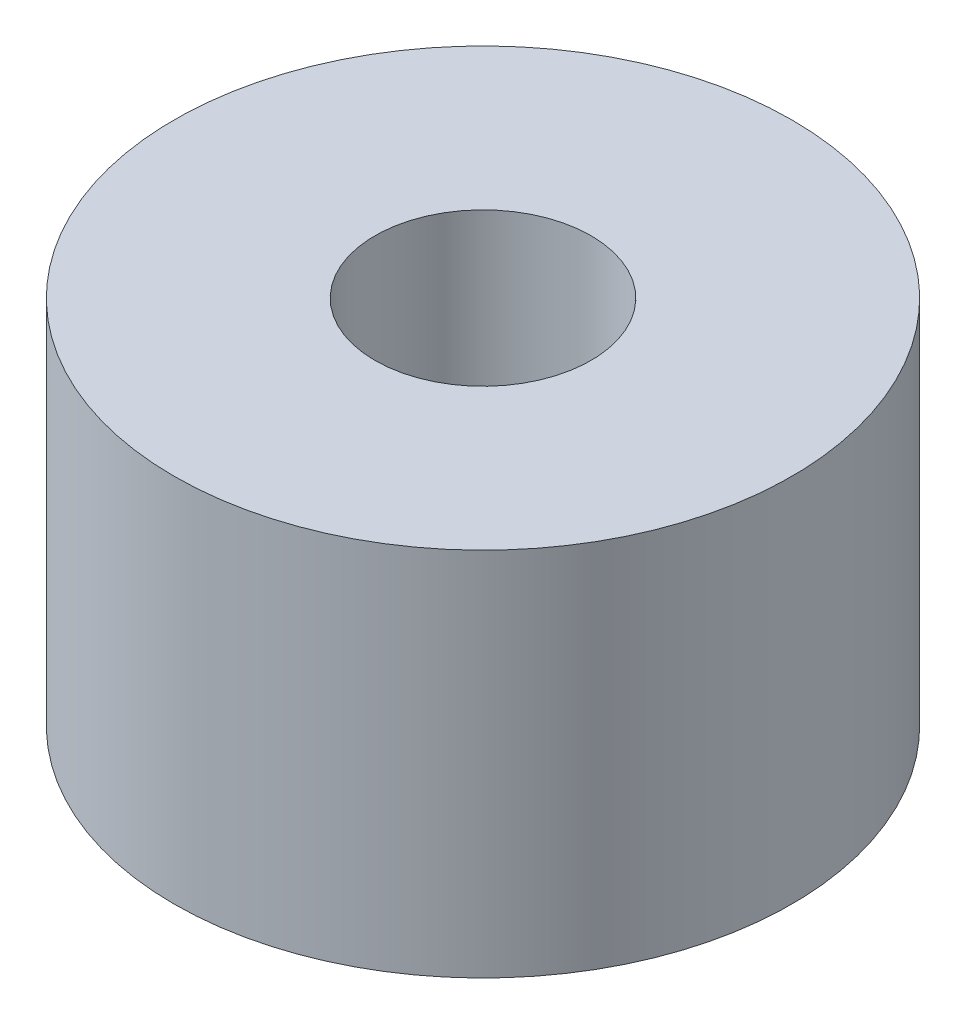
ISO-10303-21;
HEADER;
FILE_DESCRIPTION(('STEP AP214'),'2;1');
FILE_NAME('part.step','',(''),(''),'','','');
FILE_SCHEMA(('AUTOMOTIVE_DESIGN { 1 0 10303 214 1 1 1 1 }'));
ENDSEC;
DATA;
#1=APPLICATION_CONTEXT('core data for automotive mechanical design processes');
#2=APPLICATION_PROTOCOL_DEFINITION('international standard','automotive_design',2000,#1);
#3=PRODUCT_CONTEXT('',#1,'mechanical');
#4=PRODUCT('Part','Part','',(#3));
#5=PRODUCT_RELATED_PRODUCT_CATEGORY('part','',(#4));
#6=PRODUCT_DEFINITION_FORMATION('','',#4);
#7=PRODUCT_DEFINITION_CONTEXT('part definition',#1,'design');
#8=PRODUCT_DEFINITION('design','',#6,#7);
#9=PRODUCT_DEFINITION_SHAPE('','',#8);
#10=(LENGTH_UNIT() NAMED_UNIT(*) SI_UNIT(.MILLI.,.METRE.));
#11=(NAMED_UNIT(*) PLANE_ANGLE_UNIT() SI_UNIT($,.RADIAN.));
#12=(NAMED_UNIT(*) SI_UNIT($,.STERADIAN.) SOLID_ANGLE_UNIT());
#13=UNCERTAINTY_MEASURE_WITH_UNIT(LENGTH_MEASURE(1.E-05),#10,'distance_accuracy_value','');
#14=(GEOMETRIC_REPRESENTATION_CONTEXT(3) GLOBAL_UNCERTAINTY_ASSIGNED_CONTEXT((#13)) GLOBAL_UNIT_ASSIGNED_CONTEXT((#10,
#11,#12)) REPRESENTATION_CONTEXT('',''));
#15=CARTESIAN_POINT('',(0.,0.,0.));
#16=DIRECTION('',(0.,0.,1.));
#17=DIRECTION('',(1.,0.,0.));
#18=AXIS2_PLACEMENT_3D('',#15,#16,#17);
#19=CARTESIAN_POINT('',(0.,12.,0.));
#20=DIRECTION('',(0.,1.,0.));
#21=DIRECTION('',(0.,0.,1.));
#22=AXIS2_PLACEMENT_3D('',#19,#20,#21);
#23=PLANE('',#22);
#24=CARTESIAN_POINT('',(0.,12.,0.));
#25=DIRECTION('',(0.,1.,0.));
#26=DIRECTION('',(0.,0.,1.));
#27=AXIS2_PLACEMENT_3D('',#24,#25,#26);
#28=CIRCLE('',#27,10.);
#29=CARTESIAN_POINT('',(0.,12.,10.));
#30=VERTEX_POINT('',#29);
#31=EDGE_CURVE('E10',#30,#30,#28,.T.);
#32=ORIENTED_EDGE('',*,*,#31,.T.);
#33=EDGE_LOOP('',(#32));
#34=FACE_BOUND('',#33,.T.);
#35=CARTESIAN_POINT('',(0.,12.,0.));
#36=DIRECTION('',(0.,1.,0.));
#37=DIRECTION('',(0.,0.,1.));
#38=AXIS2_PLACEMENT_3D('',#35,#36,#37);
#39=CIRCLE('',#38,3.5);
#40=CARTESIAN_POINT('',(0.,12.,3.5));
#41=VERTEX_POINT('',#40);
#42=EDGE_CURVE('E41',#41,#41,#39,.T.);
#43=ORIENTED_EDGE('',*,*,#42,.F.);
#44=EDGE_LOOP('',(#43));
#45=FACE_BOUND('',#44,.T.);
#46=ADVANCED_FACE('F30',(#34,#45),#23,.T.);
#47=CARTESIAN_POINT('',(0.,0.,0.));
#48=DIRECTION('',(0.,1.,0.));
#49=DIRECTION('',(0.,0.,1.));
#50=AXIS2_PLACEMENT_3D('',#47,#48,#49);
#51=PLANE('',#50);
#52=CARTESIAN_POINT('',(0.,0.,0.));
#53=DIRECTION('',(0.,1.,0.));
#54=DIRECTION('',(0.,0.,1.));
#55=AXIS2_PLACEMENT_3D('',#52,#53,#54);
#56=CIRCLE('',#55,10.);
#57=CARTESIAN_POINT('',(0.,0.,10.));
#58=VERTEX_POINT('',#57);
#59=EDGE_CURVE('E34',#58,#58,#56,.T.);
#60=ORIENTED_EDGE('',*,*,#59,.F.);
#61=EDGE_LOOP('',(#60));
#62=FACE_BOUND('',#61,.T.);
#63=CARTESIAN_POINT('',(0.,0.,0.));
#64=DIRECTION('',(0.,1.,0.));
#65=DIRECTION('',(0.,0.,1.));
#66=AXIS2_PLACEMENT_3D('',#63,#64,#65);
#67=CIRCLE('',#66,3.5);
#68=CARTESIAN_POINT('',(0.,0.,3.5));
#69=VERTEX_POINT('',#68);
#70=EDGE_CURVE('E43',#69,#69,#67,.T.);
#71=ORIENTED_EDGE('',*,*,#70,.T.);
#72=EDGE_LOOP('',(#71));
#73=FACE_BOUND('',#72,.T.);
#74=ADVANCED_FACE('F53',(#62,#73),#51,.F.);
#75=CARTESIAN_POINT('',(0.,12.,0.));
#76=DIRECTION('',(0.,-1.,0.));
#77=DIRECTION('',(0.,0.,-1.));
#78=AXIS2_PLACEMENT_3D('',#75,#76,#77);
#79=CYLINDRICAL_SURFACE('',#78,10.);
#80=ORIENTED_EDGE('',*,*,#31,.F.);
#81=EDGE_LOOP('',(#80));
#82=FACE_BOUND('',#81,.T.);
#83=ORIENTED_EDGE('',*,*,#59,.T.);
#84=EDGE_LOOP('',(#83));
#85=FACE_BOUND('',#84,.T.);
#86=ADVANCED_FACE('F32',(#82,#85),#79,.T.);
#87=CARTESIAN_POINT('',(0.,12.,0.));
#88=DIRECTION('',(0.,-1.,0.));
#89=DIRECTION('',(0.,0.,-1.));
#90=AXIS2_PLACEMENT_3D('',#87,#88,#89);
#91=CYLINDRICAL_SURFACE('',#90,3.5);
#92=ORIENTED_EDGE('',*,*,#42,.T.);
#93=EDGE_LOOP('',(#92));
#94=FACE_BOUND('',#93,.T.);
#95=ORIENTED_EDGE('',*,*,#70,.F.);
#96=EDGE_LOOP('',(#95));
#97=FACE_BOUND('',#96,.T.);
#98=ADVANCED_FACE('F49',(#94,#97),#91,.F.);
#99=CLOSED_SHELL('',(#46,#74,#86,#98));
#100=MANIFOLD_SOLID_BREP('B2',#99);
#101=ADVANCED_BREP_SHAPE_REPRESENTATION('',(#18,#100),#14);
#102=SHAPE_DEFINITION_REPRESENTATION(#9,#101);
ENDSEC;
END-ISO-10303-21;
